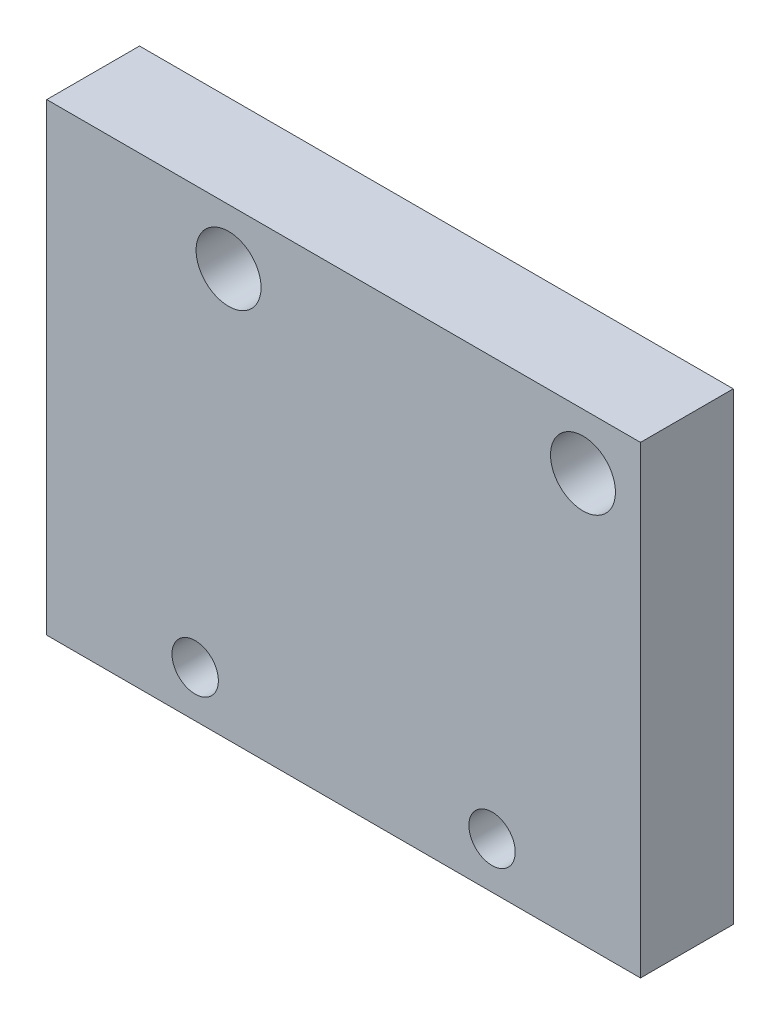
ISO-10303-21;
HEADER;
FILE_DESCRIPTION(('STEP AP214'),'2;1');
FILE_NAME('part.step','',(''),(''),'','','');
FILE_SCHEMA(('AUTOMOTIVE_DESIGN { 1 0 10303 214 1 1 1 1 }'));
ENDSEC;
DATA;
#1=APPLICATION_CONTEXT('core data for automotive mechanical design processes');
#2=APPLICATION_PROTOCOL_DEFINITION('international standard','automotive_design',2000,#1);
#3=PRODUCT_CONTEXT('',#1,'mechanical');
#4=PRODUCT('Part','Part','',(#3));
#5=PRODUCT_RELATED_PRODUCT_CATEGORY('part','',(#4));
#6=PRODUCT_DEFINITION_FORMATION('','',#4);
#7=PRODUCT_DEFINITION_CONTEXT('part definition',#1,'design');
#8=PRODUCT_DEFINITION('design','',#6,#7);
#9=PRODUCT_DEFINITION_SHAPE('','',#8);
#10=(LENGTH_UNIT() NAMED_UNIT(*) SI_UNIT(.MILLI.,.METRE.));
#11=(NAMED_UNIT(*) PLANE_ANGLE_UNIT() SI_UNIT($,.RADIAN.));
#12=(NAMED_UNIT(*) SI_UNIT($,.STERADIAN.) SOLID_ANGLE_UNIT());
#13=UNCERTAINTY_MEASURE_WITH_UNIT(LENGTH_MEASURE(1.E-05),#10,'distance_accuracy_value','');
#14=(GEOMETRIC_REPRESENTATION_CONTEXT(3) GLOBAL_UNCERTAINTY_ASSIGNED_CONTEXT((#13)) GLOBAL_UNIT_ASSIGNED_CONTEXT((#10,
#11,#12)) REPRESENTATION_CONTEXT('',''));
#15=CARTESIAN_POINT('',(0.,0.,0.));
#16=DIRECTION('',(0.,0.,1.));
#17=DIRECTION('',(1.,0.,0.));
#18=AXIS2_PLACEMENT_3D('',#15,#16,#17);
#19=CARTESIAN_POINT('',(0.,0.,5.));
#20=DIRECTION('',(0.,0.,1.));
#21=DIRECTION('',(1.,0.,0.));
#22=AXIS2_PLACEMENT_3D('',#19,#20,#21);
#23=PLANE('',#22);
#24=CARTESIAN_POINT('',(8.,-12.5,5.));
#25=DIRECTION('',(0.,0.,-1.));
#26=DIRECTION('',(-1.,0.,0.));
#27=AXIS2_PLACEMENT_3D('',#24,#25,#26);
#28=CIRCLE('',#27,1.25);
#29=CARTESIAN_POINT('',(6.75,-12.5,5.));
#30=VERTEX_POINT('',#29);
#31=EDGE_CURVE('E105',#30,#30,#28,.T.);
#32=ORIENTED_EDGE('',*,*,#31,.T.);
#33=EDGE_LOOP('',(#32));
#34=FACE_BOUND('',#33,.T.);
#35=CARTESIAN_POINT('',(-8.,-12.5,5.));
#36=DIRECTION('',(0.,0.,-1.));
#37=DIRECTION('',(-1.,0.,0.));
#38=AXIS2_PLACEMENT_3D('',#35,#36,#37);
#39=CIRCLE('',#38,1.25);
#40=CARTESIAN_POINT('',(-9.25,-12.5,5.));
#41=VERTEX_POINT('',#40);
#42=EDGE_CURVE('E111',#41,#41,#39,.T.);
#43=ORIENTED_EDGE('',*,*,#42,.T.);
#44=EDGE_LOOP('',(#43));
#45=FACE_BOUND('',#44,.T.);
#46=CARTESIAN_POINT('',(12.9,7.,5.));
#47=DIRECTION('',(0.,0.,1.));
#48=DIRECTION('',(1.,0.,0.));
#49=AXIS2_PLACEMENT_3D('',#46,#47,#48);
#50=CIRCLE('',#49,1.75);
#51=CARTESIAN_POINT('',(14.65,7.,5.));
#52=VERTEX_POINT('',#51);
#53=EDGE_CURVE('E84',#52,#52,#50,.T.);
#54=ORIENTED_EDGE('',*,*,#53,.F.);
#55=EDGE_LOOP('',(#54));
#56=FACE_BOUND('',#55,.T.);
#57=DIRECTION('',(0.,1.,0.));
#58=VECTOR('',#57,1.);
#59=CARTESIAN_POINT('',(16.,10.,5.));
#60=LINE('',#59,#58);
#61=CARTESIAN_POINT('',(16.,-15.,5.));
#62=VERTEX_POINT('',#61);
#63=CARTESIAN_POINT('',(16.,10.,5.));
#64=VERTEX_POINT('',#63);
#65=EDGE_CURVE('E69',#62,#64,#60,.T.);
#66=ORIENTED_EDGE('',*,*,#65,.T.);
#67=DIRECTION('',(-1.,0.,0.));
#68=VECTOR('',#67,1.);
#69=CARTESIAN_POINT('',(16.,10.,5.));
#70=LINE('',#69,#68);
#71=CARTESIAN_POINT('',(-16.,10.,5.));
#72=VERTEX_POINT('',#71);
#73=EDGE_CURVE('E64',#64,#72,#70,.T.);
#74=ORIENTED_EDGE('',*,*,#73,.T.);
#75=DIRECTION('',(0.,-1.,0.));
#76=VECTOR('',#75,1.);
#77=CARTESIAN_POINT('',(-16.,10.,5.));
#78=LINE('',#77,#76);
#79=CARTESIAN_POINT('',(-16.,-15.,5.));
#80=VERTEX_POINT('',#79);
#81=EDGE_CURVE('E67',#72,#80,#78,.T.);
#82=ORIENTED_EDGE('',*,*,#81,.T.);
#83=DIRECTION('',(1.,0.,0.));
#84=VECTOR('',#83,1.);
#85=CARTESIAN_POINT('',(-16.,-15.,5.));
#86=LINE('',#85,#84);
#87=EDGE_CURVE('E34',#80,#62,#86,.T.);
#88=ORIENTED_EDGE('',*,*,#87,.T.);
#89=EDGE_LOOP('',(#66,#74,#82,#88));
#90=FACE_BOUND('',#89,.T.);
#91=CARTESIAN_POINT('',(-6.2,7.,5.));
#92=DIRECTION('',(0.,0.,1.));
#93=DIRECTION('',(1.,0.,0.));
#94=AXIS2_PLACEMENT_3D('',#91,#92,#93);
#95=CIRCLE('',#94,1.75);
#96=CARTESIAN_POINT('',(-4.45,7.,5.));
#97=VERTEX_POINT('',#96);
#98=EDGE_CURVE('E99',#97,#97,#95,.T.);
#99=ORIENTED_EDGE('',*,*,#98,.F.);
#100=EDGE_LOOP('',(#99));
#101=FACE_BOUND('',#100,.T.);
#102=ADVANCED_FACE('F17',(#34,#45,#56,#90,#101),#23,.T.);
#103=CARTESIAN_POINT('',(0.,0.,0.));
#104=DIRECTION('',(0.,0.,1.));
#105=DIRECTION('',(1.,0.,0.));
#106=AXIS2_PLACEMENT_3D('',#103,#104,#105);
#107=PLANE('',#106);
#108=CARTESIAN_POINT('',(8.,-12.5,0.));
#109=DIRECTION('',(0.,0.,-1.));
#110=DIRECTION('',(-1.,0.,0.));
#111=AXIS2_PLACEMENT_3D('',#108,#109,#110);
#112=CIRCLE('',#111,1.25);
#113=CARTESIAN_POINT('',(6.75,-12.5,0.));
#114=VERTEX_POINT('',#113);
#115=EDGE_CURVE('E114',#114,#114,#112,.T.);
#116=ORIENTED_EDGE('',*,*,#115,.F.);
#117=EDGE_LOOP('',(#116));
#118=FACE_BOUND('',#117,.T.);
#119=CARTESIAN_POINT('',(-8.,-12.5,0.));
#120=DIRECTION('',(0.,0.,-1.));
#121=DIRECTION('',(-1.,0.,0.));
#122=AXIS2_PLACEMENT_3D('',#119,#120,#121);
#123=CIRCLE('',#122,1.25);
#124=CARTESIAN_POINT('',(-9.25,-12.5,0.));
#125=VERTEX_POINT('',#124);
#126=EDGE_CURVE('E108',#125,#125,#123,.T.);
#127=ORIENTED_EDGE('',*,*,#126,.F.);
#128=EDGE_LOOP('',(#127));
#129=FACE_BOUND('',#128,.T.);
#130=DIRECTION('',(0.,1.,0.));
#131=VECTOR('',#130,1.);
#132=CARTESIAN_POINT('',(16.,10.,0.));
#133=LINE('',#132,#131);
#134=CARTESIAN_POINT('',(16.,-15.,0.));
#135=VERTEX_POINT('',#134);
#136=CARTESIAN_POINT('',(16.,10.,0.));
#137=VERTEX_POINT('',#136);
#138=EDGE_CURVE('E81',#135,#137,#133,.T.);
#139=ORIENTED_EDGE('',*,*,#138,.F.);
#140=DIRECTION('',(1.,0.,0.));
#141=VECTOR('',#140,1.);
#142=CARTESIAN_POINT('',(-16.,-15.,0.));
#143=LINE('',#142,#141);
#144=CARTESIAN_POINT('',(-16.,-15.,0.));
#145=VERTEX_POINT('',#144);
#146=EDGE_CURVE('E57',#145,#135,#143,.T.);
#147=ORIENTED_EDGE('',*,*,#146,.F.);
#148=DIRECTION('',(0.,-1.,0.));
#149=VECTOR('',#148,1.);
#150=CARTESIAN_POINT('',(-16.,10.,0.));
#151=LINE('',#150,#149);
#152=CARTESIAN_POINT('',(-16.,10.,0.));
#153=VERTEX_POINT('',#152);
#154=EDGE_CURVE('E51',#153,#145,#151,.T.);
#155=ORIENTED_EDGE('',*,*,#154,.F.);
#156=DIRECTION('',(-1.,0.,0.));
#157=VECTOR('',#156,1.);
#158=CARTESIAN_POINT('',(16.,10.,0.));
#159=LINE('',#158,#157);
#160=EDGE_CURVE('E73',#137,#153,#159,.T.);
#161=ORIENTED_EDGE('',*,*,#160,.F.);
#162=EDGE_LOOP('',(#139,#147,#155,#161));
#163=FACE_BOUND('',#162,.T.);
#164=CARTESIAN_POINT('',(12.9,7.,0.));
#165=DIRECTION('',(0.,0.,1.));
#166=DIRECTION('',(1.,0.,0.));
#167=AXIS2_PLACEMENT_3D('',#164,#165,#166);
#168=CIRCLE('',#167,1.75);
#169=CARTESIAN_POINT('',(14.65,7.,0.));
#170=VERTEX_POINT('',#169);
#171=EDGE_CURVE('E96',#170,#170,#168,.T.);
#172=ORIENTED_EDGE('',*,*,#171,.T.);
#173=EDGE_LOOP('',(#172));
#174=FACE_BOUND('',#173,.T.);
#175=CARTESIAN_POINT('',(-6.2,7.,0.));
#176=DIRECTION('',(0.,0.,1.));
#177=DIRECTION('',(1.,0.,0.));
#178=AXIS2_PLACEMENT_3D('',#175,#176,#177);
#179=CIRCLE('',#178,1.75);
#180=CARTESIAN_POINT('',(-4.45,7.,0.));
#181=VERTEX_POINT('',#180);
#182=EDGE_CURVE('E102',#181,#181,#179,.T.);
#183=ORIENTED_EDGE('',*,*,#182,.T.);
#184=EDGE_LOOP('',(#183));
#185=FACE_BOUND('',#184,.T.);
#186=ADVANCED_FACE('F92',(#118,#129,#163,#174,#185),#107,.F.);
#187=CARTESIAN_POINT('',(16.,10.,5.));
#188=DIRECTION('',(-1.,0.,0.));
#189=DIRECTION('',(0.,-1.,0.));
#190=AXIS2_PLACEMENT_3D('',#187,#188,#189);
#191=PLANE('',#190);
#192=ORIENTED_EDGE('',*,*,#138,.T.);
#193=DIRECTION('',(0.,0.,-1.));
#194=VECTOR('',#193,1.);
#195=CARTESIAN_POINT('',(16.,10.,5.));
#196=LINE('',#195,#194);
#197=EDGE_CURVE('E11',#64,#137,#196,.T.);
#198=ORIENTED_EDGE('',*,*,#197,.F.);
#199=ORIENTED_EDGE('',*,*,#65,.F.);
#200=DIRECTION('',(0.,0.,-1.));
#201=VECTOR('',#200,1.);
#202=CARTESIAN_POINT('',(16.,-15.,5.));
#203=LINE('',#202,#201);
#204=EDGE_CURVE('E77',#62,#135,#203,.T.);
#205=ORIENTED_EDGE('',*,*,#204,.T.);
#206=EDGE_LOOP('',(#192,#198,#199,#205));
#207=FACE_BOUND('',#206,.T.);
#208=ADVANCED_FACE('F19',(#207),#191,.F.);
#209=CARTESIAN_POINT('',(16.,10.,5.));
#210=DIRECTION('',(0.,-1.,0.));
#211=DIRECTION('',(1.,0.,0.));
#212=AXIS2_PLACEMENT_3D('',#209,#210,#211);
#213=PLANE('',#212);
#214=ORIENTED_EDGE('',*,*,#160,.T.);
#215=DIRECTION('',(0.,0.,-1.));
#216=VECTOR('',#215,1.);
#217=CARTESIAN_POINT('',(-16.,10.,5.));
#218=LINE('',#217,#216);
#219=EDGE_CURVE('E26',#72,#153,#218,.T.);
#220=ORIENTED_EDGE('',*,*,#219,.F.);
#221=ORIENTED_EDGE('',*,*,#73,.F.);
#222=ORIENTED_EDGE('',*,*,#197,.T.);
#223=EDGE_LOOP('',(#214,#220,#221,#222));
#224=FACE_BOUND('',#223,.T.);
#225=ADVANCED_FACE('F72',(#224),#213,.F.);
#226=CARTESIAN_POINT('',(-16.,10.,5.));
#227=DIRECTION('',(1.,0.,0.));
#228=DIRECTION('',(0.,0.,-1.));
#229=AXIS2_PLACEMENT_3D('',#226,#227,#228);
#230=PLANE('',#229);
#231=ORIENTED_EDGE('',*,*,#154,.T.);
#232=DIRECTION('',(0.,0.,-1.));
#233=VECTOR('',#232,1.);
#234=CARTESIAN_POINT('',(-16.,-15.,5.));
#235=LINE('',#234,#233);
#236=EDGE_CURVE('E74',#80,#145,#235,.T.);
#237=ORIENTED_EDGE('',*,*,#236,.F.);
#238=ORIENTED_EDGE('',*,*,#81,.F.);
#239=ORIENTED_EDGE('',*,*,#219,.T.);
#240=EDGE_LOOP('',(#231,#237,#238,#239));
#241=FACE_BOUND('',#240,.T.);
#242=ADVANCED_FACE('F75',(#241),#230,.F.);
#243=CARTESIAN_POINT('',(-16.,-15.,5.));
#244=DIRECTION('',(0.,1.,0.));
#245=DIRECTION('',(0.,0.,1.));
#246=AXIS2_PLACEMENT_3D('',#243,#244,#245);
#247=PLANE('',#246);
#248=ORIENTED_EDGE('',*,*,#146,.T.);
#249=ORIENTED_EDGE('',*,*,#204,.F.);
#250=ORIENTED_EDGE('',*,*,#87,.F.);
#251=ORIENTED_EDGE('',*,*,#236,.T.);
#252=EDGE_LOOP('',(#248,#249,#250,#251));
#253=FACE_BOUND('',#252,.T.);
#254=ADVANCED_FACE('F89',(#253),#247,.F.);
#255=CARTESIAN_POINT('',(12.9,7.,5.));
#256=DIRECTION('',(0.,0.,-1.));
#257=DIRECTION('',(-1.,0.,0.));
#258=AXIS2_PLACEMENT_3D('',#255,#256,#257);
#259=CYLINDRICAL_SURFACE('',#258,1.75);
#260=ORIENTED_EDGE('',*,*,#53,.T.);
#261=EDGE_LOOP('',(#260));
#262=FACE_BOUND('',#261,.T.);
#263=ORIENTED_EDGE('',*,*,#171,.F.);
#264=EDGE_LOOP('',(#263));
#265=FACE_BOUND('',#264,.T.);
#266=ADVANCED_FACE('F143',(#262,#265),#259,.F.);
#267=CARTESIAN_POINT('',(-6.2,7.,5.));
#268=DIRECTION('',(0.,0.,-1.));
#269=DIRECTION('',(-1.,0.,0.));
#270=AXIS2_PLACEMENT_3D('',#267,#268,#269);
#271=CYLINDRICAL_SURFACE('',#270,1.75);
#272=ORIENTED_EDGE('',*,*,#98,.T.);
#273=EDGE_LOOP('',(#272));
#274=FACE_BOUND('',#273,.T.);
#275=ORIENTED_EDGE('',*,*,#182,.F.);
#276=EDGE_LOOP('',(#275));
#277=FACE_BOUND('',#276,.T.);
#278=ADVANCED_FACE('F135',(#274,#277),#271,.F.);
#279=CARTESIAN_POINT('',(-8.,-12.5,5.));
#280=DIRECTION('',(0.,0.,-1.));
#281=DIRECTION('',(-1.,0.,0.));
#282=AXIS2_PLACEMENT_3D('',#279,#280,#281);
#283=CYLINDRICAL_SURFACE('',#282,1.25);
#284=ORIENTED_EDGE('',*,*,#42,.F.);
#285=EDGE_LOOP('',(#284));
#286=FACE_BOUND('',#285,.T.);
#287=ORIENTED_EDGE('',*,*,#126,.T.);
#288=EDGE_LOOP('',(#287));
#289=FACE_BOUND('',#288,.T.);
#290=ADVANCED_FACE('F125',(#286,#289),#283,.F.);
#291=CARTESIAN_POINT('',(8.,-12.5,5.));
#292=DIRECTION('',(0.,0.,-1.));
#293=DIRECTION('',(-1.,0.,0.));
#294=AXIS2_PLACEMENT_3D('',#291,#292,#293);
#295=CYLINDRICAL_SURFACE('',#294,1.25);
#296=ORIENTED_EDGE('',*,*,#31,.F.);
#297=EDGE_LOOP('',(#296));
#298=FACE_BOUND('',#297,.T.);
#299=ORIENTED_EDGE('',*,*,#115,.T.);
#300=EDGE_LOOP('',(#299));
#301=FACE_BOUND('',#300,.T.);
#302=ADVANCED_FACE('F122',(#298,#301),#295,.F.);
#303=CLOSED_SHELL('',(#102,#186,#208,#225,#242,#254,#266,#278,#290,#302));
#304=MANIFOLD_SOLID_BREP('B1',#303);
#305=ADVANCED_BREP_SHAPE_REPRESENTATION('',(#18,#304),#14);
#306=SHAPE_DEFINITION_REPRESENTATION(#9,#305);
ENDSEC;
END-ISO-10303-21;
